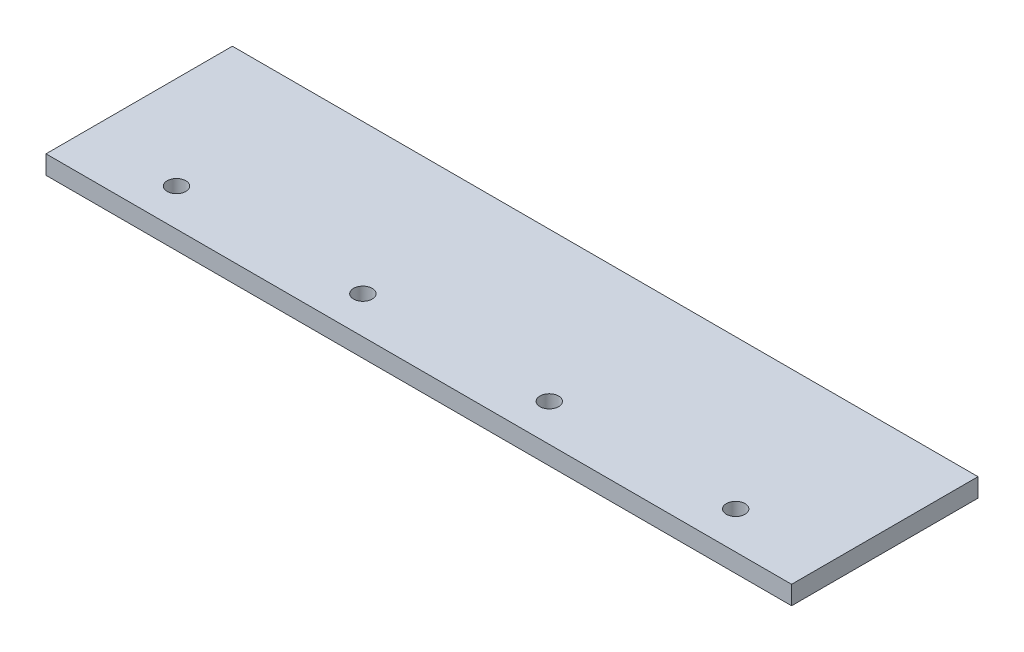
ISO-10303-21;
HEADER;
FILE_DESCRIPTION(('STEP AP214'),'2;1');
FILE_NAME('part.step','',(''),(''),'','','');
FILE_SCHEMA(('AUTOMOTIVE_DESIGN { 1 0 10303 214 1 1 1 1 }'));
ENDSEC;
DATA;
#1=APPLICATION_CONTEXT('core data for automotive mechanical design processes');
#2=APPLICATION_PROTOCOL_DEFINITION('international standard','automotive_design',2000,#1);
#3=PRODUCT_CONTEXT('',#1,'mechanical');
#4=PRODUCT('Part','Part','',(#3));
#5=PRODUCT_RELATED_PRODUCT_CATEGORY('part','',(#4));
#6=PRODUCT_DEFINITION_FORMATION('','',#4);
#7=PRODUCT_DEFINITION_CONTEXT('part definition',#1,'design');
#8=PRODUCT_DEFINITION('design','',#6,#7);
#9=PRODUCT_DEFINITION_SHAPE('','',#8);
#10=(LENGTH_UNIT() NAMED_UNIT(*) SI_UNIT(.MILLI.,.METRE.));
#11=(NAMED_UNIT(*) PLANE_ANGLE_UNIT() SI_UNIT($,.RADIAN.));
#12=(NAMED_UNIT(*) SI_UNIT($,.STERADIAN.) SOLID_ANGLE_UNIT());
#13=UNCERTAINTY_MEASURE_WITH_UNIT(LENGTH_MEASURE(1.E-05),#10,'distance_accuracy_value','');
#14=(GEOMETRIC_REPRESENTATION_CONTEXT(3) GLOBAL_UNCERTAINTY_ASSIGNED_CONTEXT((#13)) GLOBAL_UNIT_ASSIGNED_CONTEXT((#10,
#11,#12)) REPRESENTATION_CONTEXT('',''));
#15=CARTESIAN_POINT('',(0.,0.,0.));
#16=DIRECTION('',(0.,0.,1.));
#17=DIRECTION('',(1.,0.,0.));
#18=AXIS2_PLACEMENT_3D('',#15,#16,#17);
#19=CARTESIAN_POINT('',(0.,3.,0.));
#20=DIRECTION('',(0.,1.,0.));
#21=DIRECTION('',(0.,0.,1.));
#22=AXIS2_PLACEMENT_3D('',#19,#20,#21);
#23=PLANE('',#22);
#24=CARTESIAN_POINT('',(15.,3.,9.));
#25=DIRECTION('',(0.,1.,0.));
#26=DIRECTION('',(0.,0.,1.));
#27=AXIS2_PLACEMENT_3D('',#24,#25,#26);
#28=CIRCLE('',#27,1.5);
#29=CARTESIAN_POINT('',(15.,3.,10.5));
#30=VERTEX_POINT('',#29);
#31=EDGE_CURVE('E121',#30,#30,#28,.T.);
#32=ORIENTED_EDGE('',*,*,#31,.F.);
#33=EDGE_LOOP('',(#32));
#34=FACE_BOUND('',#33,.T.);
#35=CARTESIAN_POINT('',(-45.,3.,9.));
#36=DIRECTION('',(0.,1.,0.));
#37=DIRECTION('',(0.,0.,1.));
#38=AXIS2_PLACEMENT_3D('',#35,#36,#37);
#39=CIRCLE('',#38,1.5);
#40=CARTESIAN_POINT('',(-45.,3.,10.5));
#41=VERTEX_POINT('',#40);
#42=EDGE_CURVE('E100',#41,#41,#39,.T.);
#43=ORIENTED_EDGE('',*,*,#42,.F.);
#44=EDGE_LOOP('',(#43));
#45=FACE_BOUND('',#44,.T.);
#46=DIRECTION('',(0.,0.,-1.));
#47=VECTOR('',#46,1.);
#48=CARTESIAN_POINT('',(60.,3.,-15.));
#49=LINE('',#48,#47);
#50=CARTESIAN_POINT('',(60.,3.,15.));
#51=VERTEX_POINT('',#50);
#52=CARTESIAN_POINT('',(60.,3.,-15.));
#53=VERTEX_POINT('',#52);
#54=EDGE_CURVE('E85',#51,#53,#49,.T.);
#55=ORIENTED_EDGE('',*,*,#54,.T.);
#56=DIRECTION('',(-1.,0.,0.));
#57=VECTOR('',#56,1.);
#58=CARTESIAN_POINT('',(-60.,3.,-15.));
#59=LINE('',#58,#57);
#60=CARTESIAN_POINT('',(-60.,3.,-15.));
#61=VERTEX_POINT('',#60);
#62=EDGE_CURVE('E80',#53,#61,#59,.T.);
#63=ORIENTED_EDGE('',*,*,#62,.T.);
#64=DIRECTION('',(0.,0.,1.));
#65=VECTOR('',#64,1.);
#66=CARTESIAN_POINT('',(-60.,3.,-15.));
#67=LINE('',#66,#65);
#68=CARTESIAN_POINT('',(-60.,3.,15.));
#69=VERTEX_POINT('',#68);
#70=EDGE_CURVE('E83',#61,#69,#67,.T.);
#71=ORIENTED_EDGE('',*,*,#70,.T.);
#72=DIRECTION('',(1.,0.,0.));
#73=VECTOR('',#72,1.);
#74=CARTESIAN_POINT('',(-60.,3.,15.));
#75=LINE('',#74,#73);
#76=EDGE_CURVE('E50',#69,#51,#75,.T.);
#77=ORIENTED_EDGE('',*,*,#76,.T.);
#78=EDGE_LOOP('',(#55,#63,#71,#77));
#79=FACE_BOUND('',#78,.T.);
#80=CARTESIAN_POINT('',(-15.,3.,9.));
#81=DIRECTION('',(0.,1.,0.));
#82=DIRECTION('',(0.,0.,1.));
#83=AXIS2_PLACEMENT_3D('',#80,#81,#82);
#84=CIRCLE('',#83,1.5);
#85=CARTESIAN_POINT('',(-15.,3.,10.5));
#86=VERTEX_POINT('',#85);
#87=EDGE_CURVE('E115',#86,#86,#84,.T.);
#88=ORIENTED_EDGE('',*,*,#87,.F.);
#89=EDGE_LOOP('',(#88));
#90=FACE_BOUND('',#89,.T.);
#91=CARTESIAN_POINT('',(45.,3.,9.));
#92=DIRECTION('',(0.,1.,0.));
#93=DIRECTION('',(0.,0.,1.));
#94=AXIS2_PLACEMENT_3D('',#91,#92,#93);
#95=CIRCLE('',#94,1.5);
#96=CARTESIAN_POINT('',(45.,3.,10.5));
#97=VERTEX_POINT('',#96);
#98=EDGE_CURVE('E127',#97,#97,#95,.T.);
#99=ORIENTED_EDGE('',*,*,#98,.F.);
#100=EDGE_LOOP('',(#99));
#101=FACE_BOUND('',#100,.T.);
#102=ADVANCED_FACE('F33',(#34,#45,#79,#90,#101),#23,.T.);
#103=CARTESIAN_POINT('',(0.,0.,0.));
#104=DIRECTION('',(0.,1.,0.));
#105=DIRECTION('',(0.,0.,1.));
#106=AXIS2_PLACEMENT_3D('',#103,#104,#105);
#107=PLANE('',#106);
#108=DIRECTION('',(0.,0.,-1.));
#109=VECTOR('',#108,1.);
#110=CARTESIAN_POINT('',(60.,0.,-15.));
#111=LINE('',#110,#109);
#112=CARTESIAN_POINT('',(60.,0.,15.));
#113=VERTEX_POINT('',#112);
#114=CARTESIAN_POINT('',(60.,0.,-15.));
#115=VERTEX_POINT('',#114);
#116=EDGE_CURVE('E97',#113,#115,#111,.T.);
#117=ORIENTED_EDGE('',*,*,#116,.F.);
#118=DIRECTION('',(1.,0.,0.));
#119=VECTOR('',#118,1.);
#120=CARTESIAN_POINT('',(-60.,0.,15.));
#121=LINE('',#120,#119);
#122=CARTESIAN_POINT('',(-60.,0.,15.));
#123=VERTEX_POINT('',#122);
#124=EDGE_CURVE('E73',#123,#113,#121,.T.);
#125=ORIENTED_EDGE('',*,*,#124,.F.);
#126=DIRECTION('',(0.,0.,1.));
#127=VECTOR('',#126,1.);
#128=CARTESIAN_POINT('',(-60.,0.,-15.));
#129=LINE('',#128,#127);
#130=CARTESIAN_POINT('',(-60.,0.,-15.));
#131=VERTEX_POINT('',#130);
#132=EDGE_CURVE('E67',#131,#123,#129,.T.);
#133=ORIENTED_EDGE('',*,*,#132,.F.);
#134=DIRECTION('',(-1.,0.,0.));
#135=VECTOR('',#134,1.);
#136=CARTESIAN_POINT('',(-60.,0.,-15.));
#137=LINE('',#136,#135);
#138=EDGE_CURVE('E89',#115,#131,#137,.T.);
#139=ORIENTED_EDGE('',*,*,#138,.F.);
#140=EDGE_LOOP('',(#117,#125,#133,#139));
#141=FACE_BOUND('',#140,.T.);
#142=CARTESIAN_POINT('',(-45.,0.,9.));
#143=DIRECTION('',(0.,1.,0.));
#144=DIRECTION('',(0.,0.,1.));
#145=AXIS2_PLACEMENT_3D('',#142,#143,#144);
#146=CIRCLE('',#145,1.5);
#147=CARTESIAN_POINT('',(-45.,0.,10.5));
#148=VERTEX_POINT('',#147);
#149=EDGE_CURVE('E112',#148,#148,#146,.T.);
#150=ORIENTED_EDGE('',*,*,#149,.T.);
#151=EDGE_LOOP('',(#150));
#152=FACE_BOUND('',#151,.T.);
#153=CARTESIAN_POINT('',(-15.,0.,9.));
#154=DIRECTION('',(0.,1.,0.));
#155=DIRECTION('',(0.,0.,1.));
#156=AXIS2_PLACEMENT_3D('',#153,#154,#155);
#157=CIRCLE('',#156,1.5);
#158=CARTESIAN_POINT('',(-15.,0.,10.5));
#159=VERTEX_POINT('',#158);
#160=EDGE_CURVE('E118',#159,#159,#157,.T.);
#161=ORIENTED_EDGE('',*,*,#160,.T.);
#162=EDGE_LOOP('',(#161));
#163=FACE_BOUND('',#162,.T.);
#164=CARTESIAN_POINT('',(15.,0.,9.));
#165=DIRECTION('',(0.,1.,0.));
#166=DIRECTION('',(0.,0.,1.));
#167=AXIS2_PLACEMENT_3D('',#164,#165,#166);
#168=CIRCLE('',#167,1.5);
#169=CARTESIAN_POINT('',(15.,0.,10.5));
#170=VERTEX_POINT('',#169);
#171=EDGE_CURVE('E124',#170,#170,#168,.T.);
#172=ORIENTED_EDGE('',*,*,#171,.T.);
#173=EDGE_LOOP('',(#172));
#174=FACE_BOUND('',#173,.T.);
#175=CARTESIAN_POINT('',(45.,0.,9.));
#176=DIRECTION('',(0.,1.,0.));
#177=DIRECTION('',(0.,0.,1.));
#178=AXIS2_PLACEMENT_3D('',#175,#176,#177);
#179=CIRCLE('',#178,1.5);
#180=CARTESIAN_POINT('',(45.,0.,10.5));
#181=VERTEX_POINT('',#180);
#182=EDGE_CURVE('E130',#181,#181,#179,.T.);
#183=ORIENTED_EDGE('',*,*,#182,.T.);
#184=EDGE_LOOP('',(#183));
#185=FACE_BOUND('',#184,.T.);
#186=ADVANCED_FACE('F108',(#141,#152,#163,#174,#185),#107,.F.);
#187=CARTESIAN_POINT('',(60.,3.,-15.));
#188=DIRECTION('',(-1.,0.,0.));
#189=DIRECTION('',(0.,0.,1.));
#190=AXIS2_PLACEMENT_3D('',#187,#188,#189);
#191=PLANE('',#190);
#192=ORIENTED_EDGE('',*,*,#116,.T.);
#193=DIRECTION('',(0.,-1.,0.));
#194=VECTOR('',#193,1.);
#195=CARTESIAN_POINT('',(60.,3.,-15.));
#196=LINE('',#195,#194);
#197=EDGE_CURVE('E11',#53,#115,#196,.T.);
#198=ORIENTED_EDGE('',*,*,#197,.F.);
#199=ORIENTED_EDGE('',*,*,#54,.F.);
#200=DIRECTION('',(0.,-1.,0.));
#201=VECTOR('',#200,1.);
#202=CARTESIAN_POINT('',(60.,3.,15.));
#203=LINE('',#202,#201);
#204=EDGE_CURVE('E93',#51,#113,#203,.T.);
#205=ORIENTED_EDGE('',*,*,#204,.T.);
#206=EDGE_LOOP('',(#192,#198,#199,#205));
#207=FACE_BOUND('',#206,.T.);
#208=ADVANCED_FACE('F35',(#207),#191,.F.);
#209=CARTESIAN_POINT('',(-60.,3.,-15.));
#210=DIRECTION('',(0.,0.,1.));
#211=DIRECTION('',(1.,0.,0.));
#212=AXIS2_PLACEMENT_3D('',#209,#210,#211);
#213=PLANE('',#212);
#214=ORIENTED_EDGE('',*,*,#138,.T.);
#215=DIRECTION('',(0.,-1.,0.));
#216=VECTOR('',#215,1.);
#217=CARTESIAN_POINT('',(-60.,3.,-15.));
#218=LINE('',#217,#216);
#219=EDGE_CURVE('E42',#61,#131,#218,.T.);
#220=ORIENTED_EDGE('',*,*,#219,.F.);
#221=ORIENTED_EDGE('',*,*,#62,.F.);
#222=ORIENTED_EDGE('',*,*,#197,.T.);
#223=EDGE_LOOP('',(#214,#220,#221,#222));
#224=FACE_BOUND('',#223,.T.);
#225=ADVANCED_FACE('F88',(#224),#213,.F.);
#226=CARTESIAN_POINT('',(-60.,3.,-15.));
#227=DIRECTION('',(1.,0.,0.));
#228=DIRECTION('',(0.,0.,-1.));
#229=AXIS2_PLACEMENT_3D('',#226,#227,#228);
#230=PLANE('',#229);
#231=ORIENTED_EDGE('',*,*,#132,.T.);
#232=DIRECTION('',(0.,-1.,0.));
#233=VECTOR('',#232,1.);
#234=CARTESIAN_POINT('',(-60.,3.,15.));
#235=LINE('',#234,#233);
#236=EDGE_CURVE('E90',#69,#123,#235,.T.);
#237=ORIENTED_EDGE('',*,*,#236,.F.);
#238=ORIENTED_EDGE('',*,*,#70,.F.);
#239=ORIENTED_EDGE('',*,*,#219,.T.);
#240=EDGE_LOOP('',(#231,#237,#238,#239));
#241=FACE_BOUND('',#240,.T.);
#242=ADVANCED_FACE('F91',(#241),#230,.F.);
#243=CARTESIAN_POINT('',(-60.,3.,15.));
#244=DIRECTION('',(0.,0.,-1.));
#245=DIRECTION('',(-1.,0.,0.));
#246=AXIS2_PLACEMENT_3D('',#243,#244,#245);
#247=PLANE('',#246);
#248=ORIENTED_EDGE('',*,*,#124,.T.);
#249=ORIENTED_EDGE('',*,*,#204,.F.);
#250=ORIENTED_EDGE('',*,*,#76,.F.);
#251=ORIENTED_EDGE('',*,*,#236,.T.);
#252=EDGE_LOOP('',(#248,#249,#250,#251));
#253=FACE_BOUND('',#252,.T.);
#254=ADVANCED_FACE('F105',(#253),#247,.F.);
#255=CARTESIAN_POINT('',(-45.,3.,9.));
#256=DIRECTION('',(0.,-1.,0.));
#257=DIRECTION('',(0.,0.,-1.));
#258=AXIS2_PLACEMENT_3D('',#255,#256,#257);
#259=CYLINDRICAL_SURFACE('',#258,1.5);
#260=ORIENTED_EDGE('',*,*,#42,.T.);
#261=EDGE_LOOP('',(#260));
#262=FACE_BOUND('',#261,.T.);
#263=ORIENTED_EDGE('',*,*,#149,.F.);
#264=EDGE_LOOP('',(#263));
#265=FACE_BOUND('',#264,.T.);
#266=ADVANCED_FACE('F149',(#262,#265),#259,.F.);
#267=CARTESIAN_POINT('',(-15.,3.,9.));
#268=DIRECTION('',(0.,-1.,0.));
#269=DIRECTION('',(0.,0.,-1.));
#270=AXIS2_PLACEMENT_3D('',#267,#268,#269);
#271=CYLINDRICAL_SURFACE('',#270,1.5);
#272=ORIENTED_EDGE('',*,*,#87,.T.);
#273=EDGE_LOOP('',(#272));
#274=FACE_BOUND('',#273,.T.);
#275=ORIENTED_EDGE('',*,*,#160,.F.);
#276=EDGE_LOOP('',(#275));
#277=FACE_BOUND('',#276,.T.);
#278=ADVANCED_FACE('F195',(#274,#277),#271,.F.);
#279=CARTESIAN_POINT('',(15.,3.,9.));
#280=DIRECTION('',(0.,-1.,0.));
#281=DIRECTION('',(0.,0.,-1.));
#282=AXIS2_PLACEMENT_3D('',#279,#280,#281);
#283=CYLINDRICAL_SURFACE('',#282,1.5);
#284=ORIENTED_EDGE('',*,*,#31,.T.);
#285=EDGE_LOOP('',(#284));
#286=FACE_BOUND('',#285,.T.);
#287=ORIENTED_EDGE('',*,*,#171,.F.);
#288=EDGE_LOOP('',(#287));
#289=FACE_BOUND('',#288,.T.);
#290=ADVANCED_FACE('F203',(#286,#289),#283,.F.);
#291=CARTESIAN_POINT('',(45.,3.,9.));
#292=DIRECTION('',(0.,-1.,0.));
#293=DIRECTION('',(0.,0.,-1.));
#294=AXIS2_PLACEMENT_3D('',#291,#292,#293);
#295=CYLINDRICAL_SURFACE('',#294,1.5);
#296=ORIENTED_EDGE('',*,*,#98,.T.);
#297=EDGE_LOOP('',(#296));
#298=FACE_BOUND('',#297,.T.);
#299=ORIENTED_EDGE('',*,*,#182,.F.);
#300=EDGE_LOOP('',(#299));
#301=FACE_BOUND('',#300,.T.);
#302=ADVANCED_FACE('F136',(#298,#301),#295,.F.);
#303=CLOSED_SHELL('',(#102,#186,#208,#225,#242,#254,#266,#278,#290,#302));
#304=MANIFOLD_SOLID_BREP('B2',#303);
#305=ADVANCED_BREP_SHAPE_REPRESENTATION('',(#18,#304),#14);
#306=SHAPE_DEFINITION_REPRESENTATION(#9,#305);
ENDSEC;
END-ISO-10303-21;
